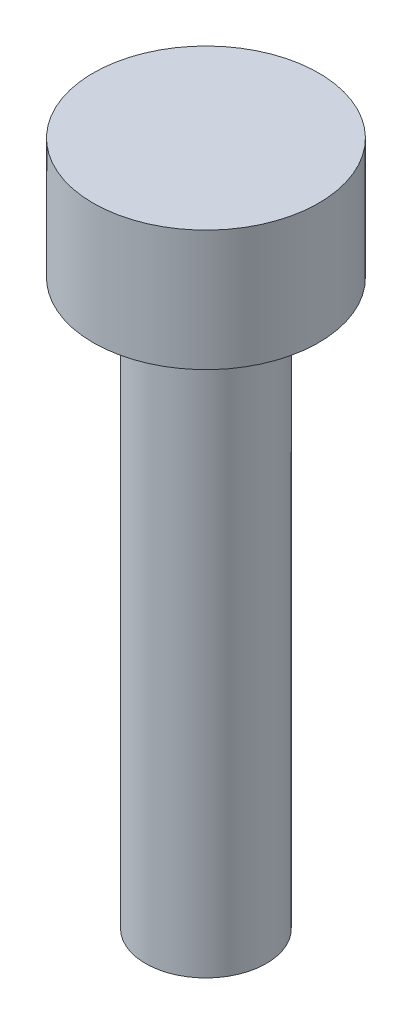
ISO-10303-21;
HEADER;
FILE_DESCRIPTION(('STEP AP214'),'2;1');
FILE_NAME('part.step','',(''),(''),'','','');
FILE_SCHEMA(('AUTOMOTIVE_DESIGN { 1 0 10303 214 1 1 1 1 }'));
ENDSEC;
DATA;
#1=APPLICATION_CONTEXT('core data for automotive mechanical design processes');
#2=APPLICATION_PROTOCOL_DEFINITION('international standard','automotive_design',2000,#1);
#3=PRODUCT_CONTEXT('',#1,'mechanical');
#4=PRODUCT('Part','Part','',(#3));
#5=PRODUCT_RELATED_PRODUCT_CATEGORY('part','',(#4));
#6=PRODUCT_DEFINITION_FORMATION('','',#4);
#7=PRODUCT_DEFINITION_CONTEXT('part definition',#1,'design');
#8=PRODUCT_DEFINITION('design','',#6,#7);
#9=PRODUCT_DEFINITION_SHAPE('','',#8);
#10=(LENGTH_UNIT() NAMED_UNIT(*) SI_UNIT(.MILLI.,.METRE.));
#11=(NAMED_UNIT(*) PLANE_ANGLE_UNIT() SI_UNIT($,.RADIAN.));
#12=(NAMED_UNIT(*) SI_UNIT($,.STERADIAN.) SOLID_ANGLE_UNIT());
#13=UNCERTAINTY_MEASURE_WITH_UNIT(LENGTH_MEASURE(1.E-05),#10,'distance_accuracy_value','');
#14=(GEOMETRIC_REPRESENTATION_CONTEXT(3) GLOBAL_UNCERTAINTY_ASSIGNED_CONTEXT((#13)) GLOBAL_UNIT_ASSIGNED_CONTEXT((#10,
#11,#12)) REPRESENTATION_CONTEXT('',''));
#15=CARTESIAN_POINT('',(0.,0.,0.));
#16=DIRECTION('',(0.,0.,1.));
#17=DIRECTION('',(1.,0.,0.));
#18=AXIS2_PLACEMENT_3D('',#15,#16,#17);
#19=CARTESIAN_POINT('',(0.,3.,0.));
#20=DIRECTION('',(0.,-1.,0.));
#21=DIRECTION('',(0.,0.,-1.));
#22=AXIS2_PLACEMENT_3D('',#19,#20,#21);
#23=CYLINDRICAL_SURFACE('',#22,2.8);
#24=CARTESIAN_POINT('',(0.,3.,0.));
#25=DIRECTION('',(0.,1.,0.));
#26=DIRECTION('',(0.,0.,1.));
#27=AXIS2_PLACEMENT_3D('',#24,#25,#26);
#28=CIRCLE('',#27,2.8);
#29=CARTESIAN_POINT('',(0.,3.,2.8));
#30=VERTEX_POINT('',#29);
#31=EDGE_CURVE('E40',#30,#30,#28,.T.);
#32=ORIENTED_EDGE('',*,*,#31,.F.);
#33=EDGE_LOOP('',(#32));
#34=FACE_BOUND('',#33,.T.);
#35=CARTESIAN_POINT('',(0.,0.,0.));
#36=DIRECTION('',(0.,1.,0.));
#37=DIRECTION('',(0.,0.,1.));
#38=AXIS2_PLACEMENT_3D('',#35,#36,#37);
#39=CIRCLE('',#38,2.8);
#40=CARTESIAN_POINT('',(0.,0.,2.8));
#41=VERTEX_POINT('',#40);
#42=EDGE_CURVE('E36',#41,#41,#39,.T.);
#43=ORIENTED_EDGE('',*,*,#42,.T.);
#44=EDGE_LOOP('',(#43));
#45=FACE_BOUND('',#44,.T.);
#46=ADVANCED_FACE('F33',(#34,#45),#23,.T.);
#47=CARTESIAN_POINT('',(0.,3.,0.));
#48=DIRECTION('',(0.,1.,0.));
#49=DIRECTION('',(0.,0.,1.));
#50=AXIS2_PLACEMENT_3D('',#47,#48,#49);
#51=PLANE('',#50);
#52=ORIENTED_EDGE('',*,*,#31,.T.);
#53=EDGE_LOOP('',(#52));
#54=FACE_BOUND('',#53,.T.);
#55=ADVANCED_FACE('F57',(#54),#51,.T.);
#56=CARTESIAN_POINT('',(0.,0.,0.));
#57=DIRECTION('',(0.,1.,0.));
#58=DIRECTION('',(0.,0.,1.));
#59=AXIS2_PLACEMENT_3D('',#56,#57,#58);
#60=PLANE('',#59);
#61=CARTESIAN_POINT('',(0.,0.,0.));
#62=DIRECTION('',(0.,-1.,0.));
#63=DIRECTION('',(0.,0.,-1.));
#64=AXIS2_PLACEMENT_3D('',#61,#62,#63);
#65=CIRCLE('',#64,1.5);
#66=CARTESIAN_POINT('',(0.,0.,-1.5));
#67=VERTEX_POINT('',#66);
#68=EDGE_CURVE('E10',#67,#67,#65,.T.);
#69=ORIENTED_EDGE('',*,*,#68,.F.);
#70=EDGE_LOOP('',(#69));
#71=FACE_BOUND('',#70,.T.);
#72=ORIENTED_EDGE('',*,*,#42,.F.);
#73=EDGE_LOOP('',(#72));
#74=FACE_BOUND('',#73,.T.);
#75=ADVANCED_FACE('F54',(#71,#74),#60,.F.);
#76=CARTESIAN_POINT('',(0.,-14.,0.));
#77=DIRECTION('',(0.,1.,0.));
#78=DIRECTION('',(0.,0.,1.));
#79=AXIS2_PLACEMENT_3D('',#76,#77,#78);
#80=CYLINDRICAL_SURFACE('',#79,1.5);
#81=CARTESIAN_POINT('',(0.,-14.,0.));
#82=DIRECTION('',(0.,-1.,0.));
#83=DIRECTION('',(0.,0.,-1.));
#84=AXIS2_PLACEMENT_3D('',#81,#82,#83);
#85=CIRCLE('',#84,1.5);
#86=CARTESIAN_POINT('',(0.,-14.,-1.5));
#87=VERTEX_POINT('',#86);
#88=EDGE_CURVE('E46',#87,#87,#85,.T.);
#89=ORIENTED_EDGE('',*,*,#88,.F.);
#90=EDGE_LOOP('',(#89));
#91=FACE_BOUND('',#90,.T.);
#92=ORIENTED_EDGE('',*,*,#68,.T.);
#93=EDGE_LOOP('',(#92));
#94=FACE_BOUND('',#93,.T.);
#95=ADVANCED_FACE('F56',(#91,#94),#80,.T.);
#96=CARTESIAN_POINT('',(0.,-14.,0.));
#97=DIRECTION('',(0.,-1.,0.));
#98=DIRECTION('',(0.,0.,-1.));
#99=AXIS2_PLACEMENT_3D('',#96,#97,#98);
#100=PLANE('',#99);
#101=ORIENTED_EDGE('',*,*,#88,.T.);
#102=EDGE_LOOP('',(#101));
#103=FACE_BOUND('',#102,.T.);
#104=ADVANCED_FACE('F63',(#103),#100,.T.);
#105=CLOSED_SHELL('',(#46,#55,#75,#95,#104));
#106=MANIFOLD_SOLID_BREP('B2',#105);
#107=ADVANCED_BREP_SHAPE_REPRESENTATION('',(#18,#106),#14);
#108=SHAPE_DEFINITION_REPRESENTATION(#9,#107);
ENDSEC;
END-ISO-10303-21;
